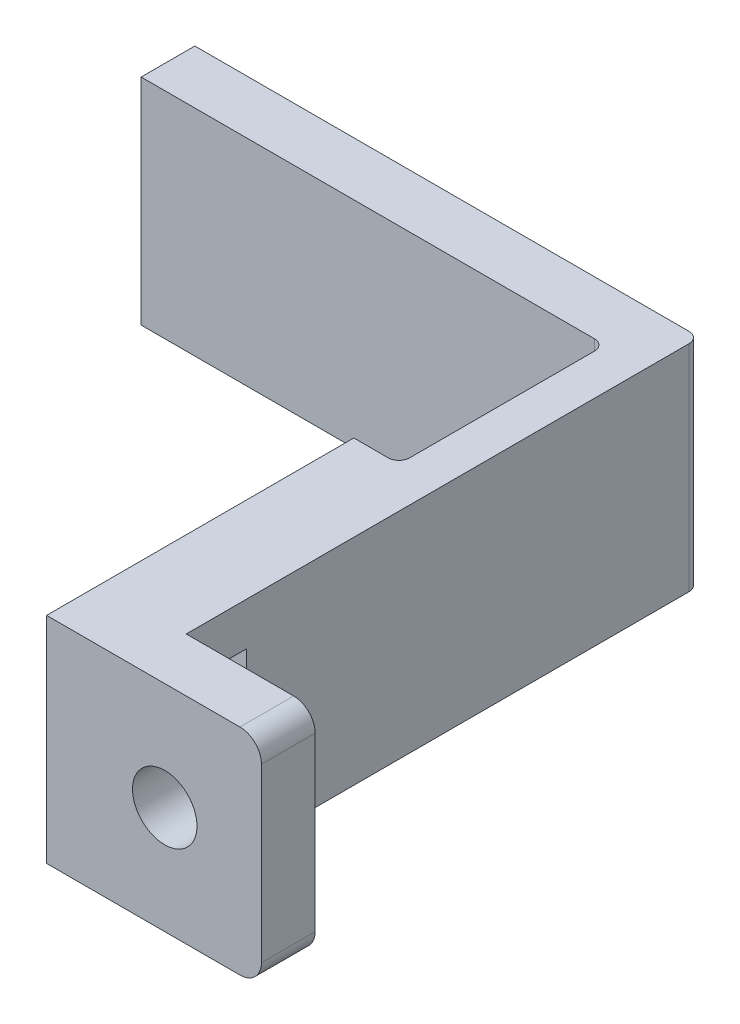
ISO-10303-21;
HEADER;
FILE_DESCRIPTION(('STEP AP214'),'2;1');
FILE_NAME('part.step','',(''),(''),'','','');
FILE_SCHEMA(('AUTOMOTIVE_DESIGN { 1 0 10303 214 1 1 1 1 }'));
ENDSEC;
DATA;
#1=APPLICATION_CONTEXT('core data for automotive mechanical design processes');
#2=APPLICATION_PROTOCOL_DEFINITION('international standard','automotive_design',2000,#1);
#3=PRODUCT_CONTEXT('',#1,'mechanical');
#4=PRODUCT('Part','Part','',(#3));
#5=PRODUCT_RELATED_PRODUCT_CATEGORY('part','',(#4));
#6=PRODUCT_DEFINITION_FORMATION('','',#4);
#7=PRODUCT_DEFINITION_CONTEXT('part definition',#1,'design');
#8=PRODUCT_DEFINITION('design','',#6,#7);
#9=PRODUCT_DEFINITION_SHAPE('','',#8);
#10=(LENGTH_UNIT() NAMED_UNIT(*) SI_UNIT(.MILLI.,.METRE.));
#11=(NAMED_UNIT(*) PLANE_ANGLE_UNIT() SI_UNIT($,.RADIAN.));
#12=(NAMED_UNIT(*) SI_UNIT($,.STERADIAN.) SOLID_ANGLE_UNIT());
#13=UNCERTAINTY_MEASURE_WITH_UNIT(LENGTH_MEASURE(1.E-05),#10,'distance_accuracy_value','');
#14=(GEOMETRIC_REPRESENTATION_CONTEXT(3) GLOBAL_UNCERTAINTY_ASSIGNED_CONTEXT((#13)) GLOBAL_UNIT_ASSIGNED_CONTEXT((#10,
#11,#12)) REPRESENTATION_CONTEXT('',''));
#15=CARTESIAN_POINT('',(0.,0.,0.));
#16=DIRECTION('',(0.,0.,1.));
#17=DIRECTION('',(1.,0.,0.));
#18=AXIS2_PLACEMENT_3D('',#15,#16,#17);
#19=CARTESIAN_POINT('',(0.,10.,-14.3));
#20=DIRECTION('',(1.,0.,0.));
#21=DIRECTION('',(0.,0.,-1.));
#22=AXIS2_PLACEMENT_3D('',#19,#20,#21);
#23=PLANE('',#22);
#24=DIRECTION('',(0.,0.,1.));
#25=VECTOR('',#24,1.);
#26=CARTESIAN_POINT('',(0.,0.,-14.3));
#27=LINE('',#26,#25);
#28=CARTESIAN_POINT('',(0.,0.,-14.3));
#29=VERTEX_POINT('',#28);
#30=CARTESIAN_POINT('',(0.,0.,0.));
#31=VERTEX_POINT('',#30);
#32=EDGE_CURVE('E215',#29,#31,#27,.T.);
#33=ORIENTED_EDGE('',*,*,#32,.T.);
#34=DIRECTION('',(0.,-1.,0.));
#35=VECTOR('',#34,1.);
#36=CARTESIAN_POINT('',(0.,10.,0.));
#37=LINE('',#36,#35);
#38=CARTESIAN_POINT('',(0.,10.,0.));
#39=VERTEX_POINT('',#38);
#40=EDGE_CURVE('E278',#39,#31,#37,.T.);
#41=ORIENTED_EDGE('',*,*,#40,.F.);
#42=DIRECTION('',(0.,0.,1.));
#43=VECTOR('',#42,1.);
#44=CARTESIAN_POINT('',(0.,10.,-14.3));
#45=LINE('',#44,#43);
#46=CARTESIAN_POINT('',(0.,10.,-14.3));
#47=VERTEX_POINT('',#46);
#48=EDGE_CURVE('E216',#47,#39,#45,.T.);
#49=ORIENTED_EDGE('',*,*,#48,.F.);
#50=DIRECTION('',(0.,-1.,0.));
#51=VECTOR('',#50,1.);
#52=CARTESIAN_POINT('',(0.,10.,-14.3));
#53=LINE('',#52,#51);
#54=EDGE_CURVE('E240',#47,#29,#53,.T.);
#55=ORIENTED_EDGE('',*,*,#54,.T.);
#56=EDGE_LOOP('',(#33,#41,#49,#55));
#57=FACE_BOUND('',#56,.T.);
#58=ADVANCED_FACE('F41',(#57),#23,.F.);
#59=CARTESIAN_POINT('',(0.,10.,0.));
#60=DIRECTION('',(0.,0.,-1.));
#61=DIRECTION('',(-1.,0.,0.));
#62=AXIS2_PLACEMENT_3D('',#59,#60,#61);
#63=PLANE('',#62);
#64=CARTESIAN_POINT('',(5.50000000000001,5.,0.));
#65=DIRECTION('',(0.,0.,-1.));
#66=DIRECTION('',(-1.,0.,0.));
#67=AXIS2_PLACEMENT_3D('',#64,#65,#66);
#68=CIRCLE('',#67,1.5);
#69=CARTESIAN_POINT('',(4.00000000000001,5.,0.));
#70=VERTEX_POINT('',#69);
#71=EDGE_CURVE('E212',#70,#70,#68,.T.);
#72=ORIENTED_EDGE('',*,*,#71,.T.);
#73=EDGE_LOOP('',(#72));
#74=FACE_BOUND('',#73,.T.);
#75=DIRECTION('',(0.,-1.,0.));
#76=VECTOR('',#75,1.);
#77=CARTESIAN_POINT('',(10.,10.,0.));
#78=LINE('',#77,#76);
#79=CARTESIAN_POINT('',(10.,9.,0.));
#80=VERTEX_POINT('',#79);
#81=CARTESIAN_POINT('',(10.,0.999999999999999,0.));
#82=VERTEX_POINT('',#81);
#83=EDGE_CURVE('E275',#80,#82,#78,.T.);
#84=ORIENTED_EDGE('',*,*,#83,.F.);
#85=CARTESIAN_POINT('',(9.,9.,0.));
#86=DIRECTION('',(0.,0.,-1.));
#87=DIRECTION('',(-1.,0.,0.));
#88=AXIS2_PLACEMENT_3D('',#85,#86,#87);
#89=CIRCLE('',#88,1.);
#90=CARTESIAN_POINT('',(9.,10.,0.));
#91=VERTEX_POINT('',#90);
#92=EDGE_CURVE('E49',#80,#91,#89,.F.);
#93=ORIENTED_EDGE('',*,*,#92,.T.);
#94=DIRECTION('',(1.,0.,0.));
#95=VECTOR('',#94,1.);
#96=CARTESIAN_POINT('',(0.,10.,0.));
#97=LINE('',#96,#95);
#98=EDGE_CURVE('E219',#39,#91,#97,.T.);
#99=ORIENTED_EDGE('',*,*,#98,.F.);
#100=ORIENTED_EDGE('',*,*,#40,.T.);
#101=DIRECTION('',(1.,0.,0.));
#102=VECTOR('',#101,1.);
#103=CARTESIAN_POINT('',(0.,0.,0.));
#104=LINE('',#103,#102);
#105=CARTESIAN_POINT('',(9.,0.,0.));
#106=VERTEX_POINT('',#105);
#107=EDGE_CURVE('E243',#31,#106,#104,.T.);
#108=ORIENTED_EDGE('',*,*,#107,.T.);
#109=CARTESIAN_POINT('',(9.,0.999999999999999,0.));
#110=DIRECTION('',(0.,0.,-1.));
#111=DIRECTION('',(-1.,0.,0.));
#112=AXIS2_PLACEMENT_3D('',#109,#110,#111);
#113=CIRCLE('',#112,1.);
#114=EDGE_CURVE('E320',#106,#82,#113,.F.);
#115=ORIENTED_EDGE('',*,*,#114,.T.);
#116=EDGE_LOOP('',(#84,#93,#99,#100,#108,#115));
#117=FACE_BOUND('',#116,.T.);
#118=ADVANCED_FACE('F324',(#74,#117),#63,.F.);
#119=CARTESIAN_POINT('',(10.,10.,0.));
#120=DIRECTION('',(-1.,0.,0.));
#121=DIRECTION('',(0.,0.,1.));
#122=AXIS2_PLACEMENT_3D('',#119,#120,#121);
#123=PLANE('',#122);
#124=DIRECTION('',(0.,-1.,0.));
#125=VECTOR('',#124,1.);
#126=CARTESIAN_POINT('',(10.,10.,-2.5));
#127=LINE('',#126,#125);
#128=CARTESIAN_POINT('',(10.,9.,-2.5));
#129=VERTEX_POINT('',#128);
#130=CARTESIAN_POINT('',(10.,0.999999999999999,-2.5));
#131=VERTEX_POINT('',#130);
#132=EDGE_CURVE('E272',#129,#131,#127,.T.);
#133=ORIENTED_EDGE('',*,*,#132,.F.);
#134=DIRECTION('',(0.,0.,-1.));
#135=VECTOR('',#134,1.);
#136=CARTESIAN_POINT('',(10.,9.,0.));
#137=LINE('',#136,#135);
#138=EDGE_CURVE('E318',#129,#80,#137,.F.);
#139=ORIENTED_EDGE('',*,*,#138,.T.);
#140=ORIENTED_EDGE('',*,*,#83,.T.);
#141=DIRECTION('',(0.,0.,-1.));
#142=VECTOR('',#141,1.);
#143=CARTESIAN_POINT('',(10.,0.999999999999999,0.));
#144=LINE('',#143,#142);
#145=EDGE_CURVE('E315',#82,#131,#144,.T.);
#146=ORIENTED_EDGE('',*,*,#145,.T.);
#147=EDGE_LOOP('',(#133,#139,#140,#146));
#148=FACE_BOUND('',#147,.T.);
#149=ADVANCED_FACE('F337',(#148),#123,.F.);
#150=CARTESIAN_POINT('',(10.,10.,-2.5));
#151=DIRECTION('',(0.,0.,1.));
#152=DIRECTION('',(1.,0.,0.));
#153=AXIS2_PLACEMENT_3D('',#150,#151,#152);
#154=PLANE('',#153);
#155=DIRECTION('',(0.,-1.,0.));
#156=VECTOR('',#155,1.);
#157=CARTESIAN_POINT('',(4.,10.,-2.5));
#158=LINE('',#157,#156);
#159=CARTESIAN_POINT('',(4.,2.,-2.5));
#160=VERTEX_POINT('',#159);
#161=CARTESIAN_POINT('',(4.,0.,-2.5));
#162=VERTEX_POINT('',#161);
#163=EDGE_CURVE('E178',#160,#162,#158,.T.);
#164=ORIENTED_EDGE('',*,*,#163,.F.);
#165=DIRECTION('',(1.,0.,0.));
#166=VECTOR('',#165,1.);
#167=CARTESIAN_POINT('',(2.,2.,-2.5));
#168=LINE('',#167,#166);
#169=CARTESIAN_POINT('',(2.,2.,-2.5));
#170=VERTEX_POINT('',#169);
#171=EDGE_CURVE('E56',#170,#160,#168,.T.);
#172=ORIENTED_EDGE('',*,*,#171,.F.);
#173=DIRECTION('',(0.,-1.,0.));
#174=VECTOR('',#173,1.);
#175=CARTESIAN_POINT('',(2.,8.,-2.5));
#176=LINE('',#175,#174);
#177=CARTESIAN_POINT('',(2.,8.,-2.5));
#178=VERTEX_POINT('',#177);
#179=EDGE_CURVE('E175',#178,#170,#176,.T.);
#180=ORIENTED_EDGE('',*,*,#179,.F.);
#181=DIRECTION('',(1.,0.,0.));
#182=VECTOR('',#181,1.);
#183=CARTESIAN_POINT('',(2.,8.,-2.5));
#184=LINE('',#183,#182);
#185=CARTESIAN_POINT('',(4.,8.,-2.5));
#186=VERTEX_POINT('',#185);
#187=EDGE_CURVE('E204',#178,#186,#184,.T.);
#188=ORIENTED_EDGE('',*,*,#187,.T.);
#189=CARTESIAN_POINT('',(4.,10.,-2.5));
#190=VERTEX_POINT('',#189);
#191=EDGE_CURVE('E269',#190,#186,#158,.T.);
#192=ORIENTED_EDGE('',*,*,#191,.F.);
#193=DIRECTION('',(-1.,0.,0.));
#194=VECTOR('',#193,1.);
#195=CARTESIAN_POINT('',(10.,10.,-2.5));
#196=LINE('',#195,#194);
#197=CARTESIAN_POINT('',(9.,10.,-2.5));
#198=VERTEX_POINT('',#197);
#199=EDGE_CURVE('E223',#198,#190,#196,.T.);
#200=ORIENTED_EDGE('',*,*,#199,.F.);
#201=CARTESIAN_POINT('',(9.,9.,-2.5));
#202=DIRECTION('',(0.,0.,1.));
#203=DIRECTION('',(1.,0.,0.));
#204=AXIS2_PLACEMENT_3D('',#201,#202,#203);
#205=CIRCLE('',#204,1.);
#206=EDGE_CURVE('E313',#198,#129,#205,.F.);
#207=ORIENTED_EDGE('',*,*,#206,.T.);
#208=ORIENTED_EDGE('',*,*,#132,.T.);
#209=CARTESIAN_POINT('',(9.,0.999999999999999,-2.5));
#210=DIRECTION('',(0.,0.,1.));
#211=DIRECTION('',(1.,0.,0.));
#212=AXIS2_PLACEMENT_3D('',#209,#210,#211);
#213=CIRCLE('',#212,1.);
#214=CARTESIAN_POINT('',(9.,0.,-2.5));
#215=VERTEX_POINT('',#214);
#216=EDGE_CURVE('E311',#131,#215,#213,.F.);
#217=ORIENTED_EDGE('',*,*,#216,.T.);
#218=DIRECTION('',(-1.,0.,0.));
#219=VECTOR('',#218,1.);
#220=CARTESIAN_POINT('',(10.,0.,-2.5));
#221=LINE('',#220,#219);
#222=EDGE_CURVE('E245',#215,#162,#221,.T.);
#223=ORIENTED_EDGE('',*,*,#222,.T.);
#224=EDGE_LOOP('',(#164,#172,#180,#188,#192,#200,#207,#208,#217,#223));
#225=FACE_BOUND('',#224,.T.);
#226=CARTESIAN_POINT('',(5.50000000000001,5.,-2.5));
#227=DIRECTION('',(0.,0.,-1.));
#228=DIRECTION('',(-1.,0.,0.));
#229=AXIS2_PLACEMENT_3D('',#226,#227,#228);
#230=CIRCLE('',#229,1.5);
#231=CARTESIAN_POINT('',(4.00000000000001,5.,-2.5));
#232=VERTEX_POINT('',#231);
#233=EDGE_CURVE('E206',#232,#232,#230,.T.);
#234=ORIENTED_EDGE('',*,*,#233,.F.);
#235=EDGE_LOOP('',(#234));
#236=FACE_BOUND('',#235,.T.);
#237=ADVANCED_FACE('F172',(#225,#236),#154,.F.);
#238=CARTESIAN_POINT('',(4.,10.,-2.5));
#239=DIRECTION('',(-1.,0.,0.));
#240=DIRECTION('',(0.,0.,1.));
#241=AXIS2_PLACEMENT_3D('',#238,#239,#240);
#242=PLANE('',#241);
#243=ORIENTED_EDGE('',*,*,#191,.T.);
#244=DIRECTION('',(0.,0.,1.));
#245=VECTOR('',#244,1.);
#246=CARTESIAN_POINT('',(4.,8.,-2.5));
#247=LINE('',#246,#245);
#248=CARTESIAN_POINT('',(4.,8.,-5.3));
#249=VERTEX_POINT('',#248);
#250=EDGE_CURVE('E192',#249,#186,#247,.T.);
#251=ORIENTED_EDGE('',*,*,#250,.F.);
#252=DIRECTION('',(0.,1.,0.));
#253=VECTOR('',#252,1.);
#254=CARTESIAN_POINT('',(4.,8.,-5.3));
#255=LINE('',#254,#253);
#256=CARTESIAN_POINT('',(4.,2.,-5.3));
#257=VERTEX_POINT('',#256);
#258=EDGE_CURVE('E195',#257,#249,#255,.T.);
#259=ORIENTED_EDGE('',*,*,#258,.F.);
#260=DIRECTION('',(0.,0.,-1.));
#261=VECTOR('',#260,1.);
#262=CARTESIAN_POINT('',(4.,2.,-2.5));
#263=LINE('',#262,#261);
#264=EDGE_CURVE('E200',#160,#257,#263,.T.);
#265=ORIENTED_EDGE('',*,*,#264,.F.);
#266=ORIENTED_EDGE('',*,*,#163,.T.);
#267=DIRECTION('',(0.,0.,-1.));
#268=VECTOR('',#267,1.);
#269=CARTESIAN_POINT('',(4.,0.,-2.5));
#270=LINE('',#269,#268);
#271=CARTESIAN_POINT('',(4.,0.,-25.9));
#272=VERTEX_POINT('',#271);
#273=EDGE_CURVE('E247',#162,#272,#270,.T.);
#274=ORIENTED_EDGE('',*,*,#273,.T.);
#275=DIRECTION('',(0.,-1.,0.));
#276=VECTOR('',#275,1.);
#277=CARTESIAN_POINT('',(4.,10.,-25.9));
#278=LINE('',#277,#276);
#279=CARTESIAN_POINT('',(4.,10.,-25.9));
#280=VERTEX_POINT('',#279);
#281=EDGE_CURVE('E291',#272,#280,#278,.F.);
#282=ORIENTED_EDGE('',*,*,#281,.T.);
#283=DIRECTION('',(0.,0.,-1.));
#284=VECTOR('',#283,1.);
#285=CARTESIAN_POINT('',(4.,10.,-2.5));
#286=LINE('',#285,#284);
#287=EDGE_CURVE('E225',#190,#280,#286,.T.);
#288=ORIENTED_EDGE('',*,*,#287,.F.);
#289=EDGE_LOOP('',(#243,#251,#259,#265,#266,#274,#282,#288));
#290=FACE_BOUND('',#289,.T.);
#291=ADVANCED_FACE('F346',(#290),#242,.F.);
#292=CARTESIAN_POINT('',(4.,10.,-26.4));
#293=DIRECTION('',(0.,0.,1.));
#294=DIRECTION('',(1.,0.,0.));
#295=AXIS2_PLACEMENT_3D('',#292,#293,#294);
#296=PLANE('',#295);
#297=DIRECTION('',(-1.,0.,0.));
#298=VECTOR('',#297,1.);
#299=CARTESIAN_POINT('',(4.,10.,-26.4));
#300=LINE('',#299,#298);
#301=CARTESIAN_POINT('',(3.5,10.,-26.4));
#302=VERTEX_POINT('',#301);
#303=CARTESIAN_POINT('',(-19.5,10.,-26.4));
#304=VERTEX_POINT('',#303);
#305=EDGE_CURVE('E228',#302,#304,#300,.T.);
#306=ORIENTED_EDGE('',*,*,#305,.F.);
#307=DIRECTION('',(0.,-1.,0.));
#308=VECTOR('',#307,1.);
#309=CARTESIAN_POINT('',(3.5,10.,-26.4));
#310=LINE('',#309,#308);
#311=CARTESIAN_POINT('',(3.5,0.,-26.4));
#312=VERTEX_POINT('',#311);
#313=EDGE_CURVE('E286',#302,#312,#310,.T.);
#314=ORIENTED_EDGE('',*,*,#313,.T.);
#315=DIRECTION('',(-1.,0.,0.));
#316=VECTOR('',#315,1.);
#317=CARTESIAN_POINT('',(4.,0.,-26.4));
#318=LINE('',#317,#316);
#319=CARTESIAN_POINT('',(-19.5,0.,-26.4));
#320=VERTEX_POINT('',#319);
#321=EDGE_CURVE('E250',#312,#320,#318,.T.);
#322=ORIENTED_EDGE('',*,*,#321,.T.);
#323=DIRECTION('',(0.,-1.,0.));
#324=VECTOR('',#323,1.);
#325=CARTESIAN_POINT('',(-19.5,10.,-26.4));
#326=LINE('',#325,#324);
#327=EDGE_CURVE('E266',#304,#320,#326,.T.);
#328=ORIENTED_EDGE('',*,*,#327,.F.);
#329=EDGE_LOOP('',(#306,#314,#322,#328));
#330=FACE_BOUND('',#329,.T.);
#331=ADVANCED_FACE('F355',(#330),#296,.F.);
#332=CARTESIAN_POINT('',(-19.5,10.,-26.4));
#333=DIRECTION('',(1.,0.,0.));
#334=DIRECTION('',(0.,0.,-1.));
#335=AXIS2_PLACEMENT_3D('',#332,#333,#334);
#336=PLANE('',#335);
#337=DIRECTION('',(0.,0.,1.));
#338=VECTOR('',#337,1.);
#339=CARTESIAN_POINT('',(-19.5,0.,-26.4));
#340=LINE('',#339,#338);
#341=CARTESIAN_POINT('',(-19.5,0.,-23.9));
#342=VERTEX_POINT('',#341);
#343=EDGE_CURVE('E252',#320,#342,#340,.T.);
#344=ORIENTED_EDGE('',*,*,#343,.T.);
#345=DIRECTION('',(0.,-1.,0.));
#346=VECTOR('',#345,1.);
#347=CARTESIAN_POINT('',(-19.5,10.,-23.9));
#348=LINE('',#347,#346);
#349=CARTESIAN_POINT('',(-19.5,10.,-23.9));
#350=VERTEX_POINT('',#349);
#351=EDGE_CURVE('E263',#350,#342,#348,.T.);
#352=ORIENTED_EDGE('',*,*,#351,.F.);
#353=DIRECTION('',(0.,0.,1.));
#354=VECTOR('',#353,1.);
#355=CARTESIAN_POINT('',(-19.5,10.,-26.4));
#356=LINE('',#355,#354);
#357=EDGE_CURVE('E230',#304,#350,#356,.T.);
#358=ORIENTED_EDGE('',*,*,#357,.F.);
#359=ORIENTED_EDGE('',*,*,#327,.T.);
#360=EDGE_LOOP('',(#344,#352,#358,#359));
#361=FACE_BOUND('',#360,.T.);
#362=ADVANCED_FACE('F360',(#361),#336,.F.);
#363=CARTESIAN_POINT('',(-19.5,10.,-23.9));
#364=DIRECTION('',(0.,0.,-1.));
#365=DIRECTION('',(-1.,0.,0.));
#366=AXIS2_PLACEMENT_3D('',#363,#364,#365);
#367=PLANE('',#366);
#368=DIRECTION('',(1.,0.,0.));
#369=VECTOR('',#368,1.);
#370=CARTESIAN_POINT('',(-19.5,0.,-23.9));
#371=LINE('',#370,#369);
#372=CARTESIAN_POINT('',(1.6,0.,-23.9));
#373=VERTEX_POINT('',#372);
#374=EDGE_CURVE('E254',#342,#373,#371,.T.);
#375=ORIENTED_EDGE('',*,*,#374,.T.);
#376=DIRECTION('',(0.,-1.,0.));
#377=VECTOR('',#376,1.);
#378=CARTESIAN_POINT('',(1.6,10.,-23.9));
#379=LINE('',#378,#377);
#380=CARTESIAN_POINT('',(1.6,10.,-23.9));
#381=VERTEX_POINT('',#380);
#382=EDGE_CURVE('E284',#373,#381,#379,.F.);
#383=ORIENTED_EDGE('',*,*,#382,.T.);
#384=DIRECTION('',(1.,0.,0.));
#385=VECTOR('',#384,1.);
#386=CARTESIAN_POINT('',(-19.5,10.,-23.9));
#387=LINE('',#386,#385);
#388=EDGE_CURVE('E232',#350,#381,#387,.T.);
#389=ORIENTED_EDGE('',*,*,#388,.F.);
#390=ORIENTED_EDGE('',*,*,#351,.T.);
#391=EDGE_LOOP('',(#375,#383,#389,#390));
#392=FACE_BOUND('',#391,.T.);
#393=ADVANCED_FACE('F431',(#392),#367,.F.);
#394=CARTESIAN_POINT('',(2.1,10.,-23.9));
#395=DIRECTION('',(1.,0.,0.));
#396=DIRECTION('',(0.,0.,-1.));
#397=AXIS2_PLACEMENT_3D('',#394,#395,#396);
#398=PLANE('',#397);
#399=DIRECTION('',(0.,0.,1.));
#400=VECTOR('',#399,1.);
#401=CARTESIAN_POINT('',(2.1,0.,-23.9));
#402=LINE('',#401,#400);
#403=CARTESIAN_POINT('',(2.1,0.,-23.4));
#404=VERTEX_POINT('',#403);
#405=CARTESIAN_POINT('',(2.1,0.,-14.8));
#406=VERTEX_POINT('',#405);
#407=EDGE_CURVE('E257',#404,#406,#402,.T.);
#408=ORIENTED_EDGE('',*,*,#407,.T.);
#409=DIRECTION('',(0.,-1.,0.));
#410=VECTOR('',#409,1.);
#411=CARTESIAN_POINT('',(2.1,10.,-14.8));
#412=LINE('',#411,#410);
#413=CARTESIAN_POINT('',(2.1,10.,-14.8));
#414=VERTEX_POINT('',#413);
#415=EDGE_CURVE('E302',#406,#414,#412,.F.);
#416=ORIENTED_EDGE('',*,*,#415,.T.);
#417=DIRECTION('',(0.,0.,1.));
#418=VECTOR('',#417,1.);
#419=CARTESIAN_POINT('',(2.1,10.,-23.9));
#420=LINE('',#419,#418);
#421=CARTESIAN_POINT('',(2.1,10.,-23.4));
#422=VERTEX_POINT('',#421);
#423=EDGE_CURVE('E235',#422,#414,#420,.T.);
#424=ORIENTED_EDGE('',*,*,#423,.F.);
#425=DIRECTION('',(0.,-1.,0.));
#426=VECTOR('',#425,1.);
#427=CARTESIAN_POINT('',(2.1,0.,-23.4));
#428=LINE('',#427,#426);
#429=EDGE_CURVE('E281',#422,#404,#428,.T.);
#430=ORIENTED_EDGE('',*,*,#429,.T.);
#431=EDGE_LOOP('',(#408,#416,#424,#430));
#432=FACE_BOUND('',#431,.T.);
#433=ADVANCED_FACE('F371',(#432),#398,.F.);
#434=CARTESIAN_POINT('',(2.1,10.,-14.3));
#435=DIRECTION('',(0.,0.,1.));
#436=DIRECTION('',(1.,0.,0.));
#437=AXIS2_PLACEMENT_3D('',#434,#435,#436);
#438=PLANE('',#437);
#439=DIRECTION('',(-1.,0.,0.));
#440=VECTOR('',#439,1.);
#441=CARTESIAN_POINT('',(2.1,10.,-14.3));
#442=LINE('',#441,#440);
#443=CARTESIAN_POINT('',(1.6,10.,-14.3));
#444=VERTEX_POINT('',#443);
#445=EDGE_CURVE('E238',#444,#47,#442,.T.);
#446=ORIENTED_EDGE('',*,*,#445,.F.);
#447=DIRECTION('',(0.,-1.,0.));
#448=VECTOR('',#447,1.);
#449=CARTESIAN_POINT('',(1.6,0.,-14.3));
#450=LINE('',#449,#448);
#451=CARTESIAN_POINT('',(1.6,0.,-14.3));
#452=VERTEX_POINT('',#451);
#453=EDGE_CURVE('E299',#444,#452,#450,.T.);
#454=ORIENTED_EDGE('',*,*,#453,.T.);
#455=DIRECTION('',(-1.,0.,0.));
#456=VECTOR('',#455,1.);
#457=CARTESIAN_POINT('',(2.1,0.,-14.3));
#458=LINE('',#457,#456);
#459=EDGE_CURVE('E220',#452,#29,#458,.T.);
#460=ORIENTED_EDGE('',*,*,#459,.T.);
#461=ORIENTED_EDGE('',*,*,#54,.F.);
#462=EDGE_LOOP('',(#446,#454,#460,#461));
#463=FACE_BOUND('',#462,.T.);
#464=ADVANCED_FACE('F382',(#463),#438,.F.);
#465=CARTESIAN_POINT('',(0.,10.,0.));
#466=DIRECTION('',(0.,1.,0.));
#467=DIRECTION('',(0.,0.,1.));
#468=AXIS2_PLACEMENT_3D('',#465,#466,#467);
#469=PLANE('',#468);
#470=ORIENTED_EDGE('',*,*,#98,.T.);
#471=DIRECTION('',(0.,0.,-1.));
#472=VECTOR('',#471,1.);
#473=CARTESIAN_POINT('',(9.,10.,-2.5));
#474=LINE('',#473,#472);
#475=EDGE_CURVE('E308',#91,#198,#474,.T.);
#476=ORIENTED_EDGE('',*,*,#475,.T.);
#477=ORIENTED_EDGE('',*,*,#199,.T.);
#478=ORIENTED_EDGE('',*,*,#287,.T.);
#479=CARTESIAN_POINT('',(3.5,10.,-25.9));
#480=DIRECTION('',(0.,1.,0.));
#481=DIRECTION('',(0.,0.,1.));
#482=AXIS2_PLACEMENT_3D('',#479,#480,#481);
#483=CIRCLE('',#482,0.5);
#484=EDGE_CURVE('E293',#280,#302,#483,.T.);
#485=ORIENTED_EDGE('',*,*,#484,.T.);
#486=ORIENTED_EDGE('',*,*,#305,.T.);
#487=ORIENTED_EDGE('',*,*,#357,.T.);
#488=ORIENTED_EDGE('',*,*,#388,.T.);
#489=CARTESIAN_POINT('',(1.6,10.,-23.4));
#490=DIRECTION('',(0.,1.,0.));
#491=DIRECTION('',(0.,0.,1.));
#492=AXIS2_PLACEMENT_3D('',#489,#490,#491);
#493=CIRCLE('',#492,0.5);
#494=EDGE_CURVE('E297',#381,#422,#493,.F.);
#495=ORIENTED_EDGE('',*,*,#494,.T.);
#496=ORIENTED_EDGE('',*,*,#423,.T.);
#497=CARTESIAN_POINT('',(1.6,10.,-14.8));
#498=DIRECTION('',(0.,1.,0.));
#499=DIRECTION('',(0.,0.,1.));
#500=AXIS2_PLACEMENT_3D('',#497,#498,#499);
#501=CIRCLE('',#500,0.5);
#502=EDGE_CURVE('E306',#414,#444,#501,.F.);
#503=ORIENTED_EDGE('',*,*,#502,.T.);
#504=ORIENTED_EDGE('',*,*,#445,.T.);
#505=ORIENTED_EDGE('',*,*,#48,.T.);
#506=EDGE_LOOP('',(#470,#476,#477,#478,#485,#486,#487,#488,#495,#496,#503,#504,#505));
#507=FACE_BOUND('',#506,.T.);
#508=ADVANCED_FACE('F329',(#507),#469,.T.);
#509=CARTESIAN_POINT('',(0.,0.,0.));
#510=DIRECTION('',(0.,1.,0.));
#511=DIRECTION('',(0.,0.,1.));
#512=AXIS2_PLACEMENT_3D('',#509,#510,#511);
#513=PLANE('',#512);
#514=ORIENTED_EDGE('',*,*,#222,.F.);
#515=DIRECTION('',(0.,0.,-1.));
#516=VECTOR('',#515,1.);
#517=CARTESIAN_POINT('',(9.,0.,0.));
#518=LINE('',#517,#516);
#519=EDGE_CURVE('E11',#215,#106,#518,.F.);
#520=ORIENTED_EDGE('',*,*,#519,.T.);
#521=ORIENTED_EDGE('',*,*,#107,.F.);
#522=ORIENTED_EDGE('',*,*,#32,.F.);
#523=ORIENTED_EDGE('',*,*,#459,.F.);
#524=CARTESIAN_POINT('',(1.6,0.,-14.8));
#525=DIRECTION('',(0.,1.,0.));
#526=DIRECTION('',(0.,0.,1.));
#527=AXIS2_PLACEMENT_3D('',#524,#525,#526);
#528=CIRCLE('',#527,0.5);
#529=EDGE_CURVE('E304',#452,#406,#528,.T.);
#530=ORIENTED_EDGE('',*,*,#529,.T.);
#531=ORIENTED_EDGE('',*,*,#407,.F.);
#532=CARTESIAN_POINT('',(1.6,0.,-23.4));
#533=DIRECTION('',(0.,1.,0.));
#534=DIRECTION('',(0.,0.,1.));
#535=AXIS2_PLACEMENT_3D('',#532,#533,#534);
#536=CIRCLE('',#535,0.5);
#537=EDGE_CURVE('E295',#404,#373,#536,.T.);
#538=ORIENTED_EDGE('',*,*,#537,.T.);
#539=ORIENTED_EDGE('',*,*,#374,.F.);
#540=ORIENTED_EDGE('',*,*,#343,.F.);
#541=ORIENTED_EDGE('',*,*,#321,.F.);
#542=CARTESIAN_POINT('',(3.5,0.,-25.9));
#543=DIRECTION('',(0.,1.,0.));
#544=DIRECTION('',(0.,0.,1.));
#545=AXIS2_PLACEMENT_3D('',#542,#543,#544);
#546=CIRCLE('',#545,0.5);
#547=EDGE_CURVE('E289',#312,#272,#546,.F.);
#548=ORIENTED_EDGE('',*,*,#547,.T.);
#549=ORIENTED_EDGE('',*,*,#273,.F.);
#550=EDGE_LOOP('',(#514,#520,#521,#522,#523,#530,#531,#538,#539,#540,#541,#548,#549));
#551=FACE_BOUND('',#550,.T.);
#552=ADVANCED_FACE('F342',(#551),#513,.F.);
#553=CARTESIAN_POINT('',(5.50000000000001,5.,7.5));
#554=DIRECTION('',(0.,0.,-1.));
#555=DIRECTION('',(-1.,0.,0.));
#556=AXIS2_PLACEMENT_3D('',#553,#554,#555);
#557=CYLINDRICAL_SURFACE('',#556,1.5);
#558=ORIENTED_EDGE('',*,*,#233,.T.);
#559=EDGE_LOOP('',(#558));
#560=FACE_BOUND('',#559,.T.);
#561=ORIENTED_EDGE('',*,*,#71,.F.);
#562=EDGE_LOOP('',(#561));
#563=FACE_BOUND('',#562,.T.);
#564=ADVANCED_FACE('F396',(#560,#563),#557,.F.);
#565=CARTESIAN_POINT('',(1.6,10.,-23.4));
#566=DIRECTION('',(0.,1.,0.));
#567=DIRECTION('',(0.,0.,1.));
#568=AXIS2_PLACEMENT_3D('',#565,#566,#567);
#569=CYLINDRICAL_SURFACE('',#568,0.5);
#570=ORIENTED_EDGE('',*,*,#494,.F.);
#571=ORIENTED_EDGE('',*,*,#382,.F.);
#572=ORIENTED_EDGE('',*,*,#537,.F.);
#573=ORIENTED_EDGE('',*,*,#429,.F.);
#574=EDGE_LOOP('',(#570,#571,#572,#573));
#575=FACE_BOUND('',#574,.T.);
#576=ADVANCED_FACE('F368',(#575),#569,.F.);
#577=CARTESIAN_POINT('',(3.5,10.,-25.9));
#578=DIRECTION('',(0.,-1.,0.));
#579=DIRECTION('',(0.,0.,-1.));
#580=AXIS2_PLACEMENT_3D('',#577,#578,#579);
#581=CYLINDRICAL_SURFACE('',#580,0.5);
#582=ORIENTED_EDGE('',*,*,#484,.F.);
#583=ORIENTED_EDGE('',*,*,#281,.F.);
#584=ORIENTED_EDGE('',*,*,#547,.F.);
#585=ORIENTED_EDGE('',*,*,#313,.F.);
#586=EDGE_LOOP('',(#582,#583,#584,#585));
#587=FACE_BOUND('',#586,.T.);
#588=ADVANCED_FACE('F350',(#587),#581,.T.);
#589=CARTESIAN_POINT('',(1.6,10.,-14.8));
#590=DIRECTION('',(0.,1.,0.));
#591=DIRECTION('',(0.,0.,1.));
#592=AXIS2_PLACEMENT_3D('',#589,#590,#591);
#593=CYLINDRICAL_SURFACE('',#592,0.5);
#594=ORIENTED_EDGE('',*,*,#502,.F.);
#595=ORIENTED_EDGE('',*,*,#415,.F.);
#596=ORIENTED_EDGE('',*,*,#529,.F.);
#597=ORIENTED_EDGE('',*,*,#453,.F.);
#598=EDGE_LOOP('',(#594,#595,#596,#597));
#599=FACE_BOUND('',#598,.T.);
#600=ADVANCED_FACE('F379',(#599),#593,.F.);
#601=CARTESIAN_POINT('',(9.,9.,0.));
#602=DIRECTION('',(0.,0.,1.));
#603=DIRECTION('',(1.,0.,0.));
#604=AXIS2_PLACEMENT_3D('',#601,#602,#603);
#605=CYLINDRICAL_SURFACE('',#604,1.);
#606=ORIENTED_EDGE('',*,*,#92,.F.);
#607=ORIENTED_EDGE('',*,*,#138,.F.);
#608=ORIENTED_EDGE('',*,*,#206,.F.);
#609=ORIENTED_EDGE('',*,*,#475,.F.);
#610=EDGE_LOOP('',(#606,#607,#608,#609));
#611=FACE_BOUND('',#610,.T.);
#612=ADVANCED_FACE('F333',(#611),#605,.T.);
#613=CARTESIAN_POINT('',(9.,0.999999999999999,0.));
#614=DIRECTION('',(0.,0.,-1.));
#615=DIRECTION('',(-1.,0.,0.));
#616=AXIS2_PLACEMENT_3D('',#613,#614,#615);
#617=CYLINDRICAL_SURFACE('',#616,1.);
#618=ORIENTED_EDGE('',*,*,#114,.F.);
#619=ORIENTED_EDGE('',*,*,#519,.F.);
#620=ORIENTED_EDGE('',*,*,#216,.F.);
#621=ORIENTED_EDGE('',*,*,#145,.F.);
#622=EDGE_LOOP('',(#618,#619,#620,#621));
#623=FACE_BOUND('',#622,.T.);
#624=ADVANCED_FACE('F43',(#623),#617,.T.);
#625=CARTESIAN_POINT('',(2.,8.,-2.5));
#626=DIRECTION('',(0.,1.,0.));
#627=DIRECTION('',(0.,0.,1.));
#628=AXIS2_PLACEMENT_3D('',#625,#626,#627);
#629=PLANE('',#628);
#630=ORIENTED_EDGE('',*,*,#250,.T.);
#631=ORIENTED_EDGE('',*,*,#187,.F.);
#632=DIRECTION('',(0.,0.,1.));
#633=VECTOR('',#632,1.);
#634=CARTESIAN_POINT('',(2.,8.,-2.5));
#635=LINE('',#634,#633);
#636=CARTESIAN_POINT('',(2.,8.,-5.3));
#637=VERTEX_POINT('',#636);
#638=EDGE_CURVE('E180',#637,#178,#635,.T.);
#639=ORIENTED_EDGE('',*,*,#638,.F.);
#640=DIRECTION('',(1.,0.,0.));
#641=VECTOR('',#640,1.);
#642=CARTESIAN_POINT('',(2.,8.,-5.3));
#643=LINE('',#642,#641);
#644=EDGE_CURVE('E207',#637,#249,#643,.T.);
#645=ORIENTED_EDGE('',*,*,#644,.T.);
#646=EDGE_LOOP('',(#630,#631,#639,#645));
#647=FACE_BOUND('',#646,.T.);
#648=ADVANCED_FACE('F404',(#647),#629,.F.);
#649=CARTESIAN_POINT('',(2.,8.,-5.3));
#650=DIRECTION('',(0.,0.,-1.));
#651=DIRECTION('',(-1.,0.,0.));
#652=AXIS2_PLACEMENT_3D('',#649,#650,#651);
#653=PLANE('',#652);
#654=ORIENTED_EDGE('',*,*,#258,.T.);
#655=ORIENTED_EDGE('',*,*,#644,.F.);
#656=DIRECTION('',(0.,1.,0.));
#657=VECTOR('',#656,1.);
#658=CARTESIAN_POINT('',(2.,8.,-5.3));
#659=LINE('',#658,#657);
#660=CARTESIAN_POINT('',(2.,2.,-5.3));
#661=VERTEX_POINT('',#660);
#662=EDGE_CURVE('E188',#661,#637,#659,.T.);
#663=ORIENTED_EDGE('',*,*,#662,.F.);
#664=DIRECTION('',(1.,0.,0.));
#665=VECTOR('',#664,1.);
#666=CARTESIAN_POINT('',(2.,2.,-5.3));
#667=LINE('',#666,#665);
#668=EDGE_CURVE('E179',#661,#257,#667,.T.);
#669=ORIENTED_EDGE('',*,*,#668,.T.);
#670=EDGE_LOOP('',(#654,#655,#663,#669));
#671=FACE_BOUND('',#670,.T.);
#672=ADVANCED_FACE('F408',(#671),#653,.F.);
#673=CARTESIAN_POINT('',(2.,2.,-2.5));
#674=DIRECTION('',(0.,-1.,0.));
#675=DIRECTION('',(0.,0.,-1.));
#676=AXIS2_PLACEMENT_3D('',#673,#674,#675);
#677=PLANE('',#676);
#678=ORIENTED_EDGE('',*,*,#264,.T.);
#679=ORIENTED_EDGE('',*,*,#668,.F.);
#680=DIRECTION('',(0.,0.,-1.));
#681=VECTOR('',#680,1.);
#682=CARTESIAN_POINT('',(2.,2.,-2.5));
#683=LINE('',#682,#681);
#684=EDGE_CURVE('E183',#170,#661,#683,.T.);
#685=ORIENTED_EDGE('',*,*,#684,.F.);
#686=ORIENTED_EDGE('',*,*,#171,.T.);
#687=EDGE_LOOP('',(#678,#679,#685,#686));
#688=FACE_BOUND('',#687,.T.);
#689=ADVANCED_FACE('F184',(#688),#677,.F.);
#690=CARTESIAN_POINT('',(2.,0.,0.));
#691=DIRECTION('',(1.,0.,0.));
#692=DIRECTION('',(0.,0.,-1.));
#693=AXIS2_PLACEMENT_3D('',#690,#691,#692);
#694=PLANE('',#693);
#695=ORIENTED_EDGE('',*,*,#179,.T.);
#696=ORIENTED_EDGE('',*,*,#684,.T.);
#697=ORIENTED_EDGE('',*,*,#662,.T.);
#698=ORIENTED_EDGE('',*,*,#638,.T.);
#699=EDGE_LOOP('',(#695,#696,#697,#698));
#700=FACE_BOUND('',#699,.T.);
#701=ADVANCED_FACE('F190',(#700),#694,.T.);
#702=CLOSED_SHELL('',(#58,#118,#149,#237,#291,#331,#362,#393,#433,#464,#508,#552,#564,#576,#588,
#600,#612,#624,#648,#672,#689,#701));
#703=MANIFOLD_SOLID_BREP('B2',#702);
#704=ADVANCED_BREP_SHAPE_REPRESENTATION('',(#18,#703),#14);
#705=SHAPE_DEFINITION_REPRESENTATION(#9,#704);
ENDSEC;
END-ISO-10303-21;
